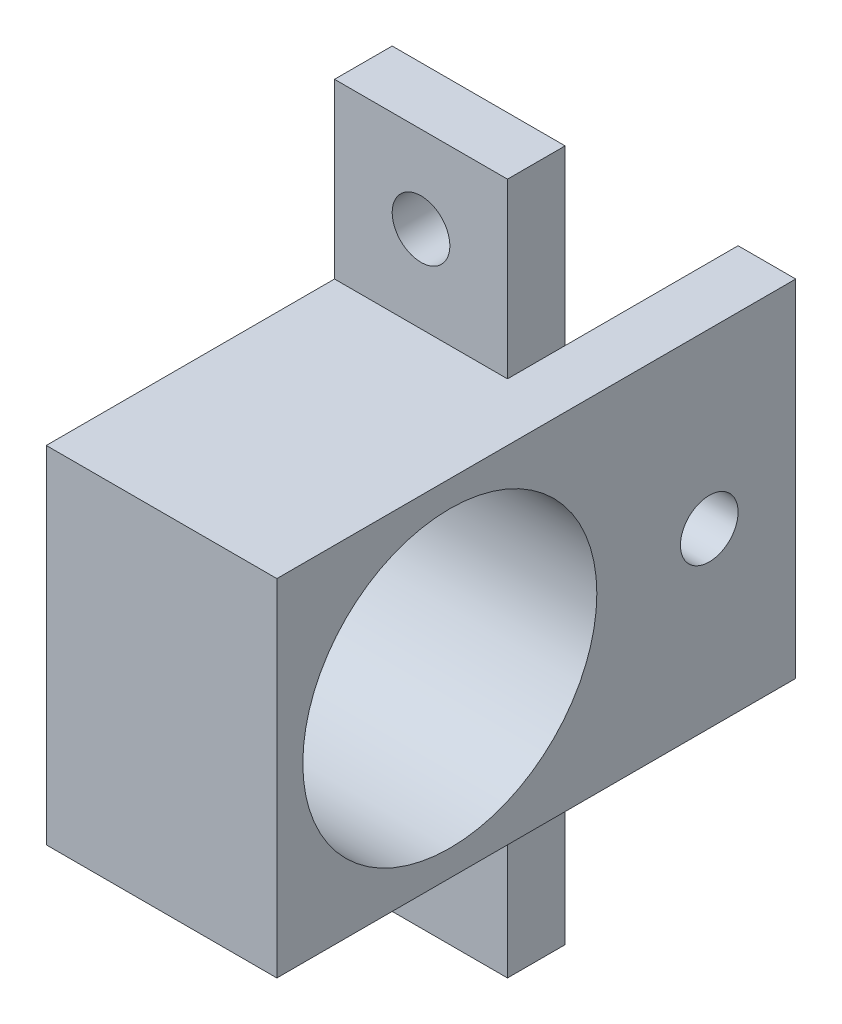
ISO-10303-21;
HEADER;
FILE_DESCRIPTION(('STEP AP214'),'2;1');
FILE_NAME('part.step','',(''),(''),'','','');
FILE_SCHEMA(('AUTOMOTIVE_DESIGN { 1 0 10303 214 1 1 1 1 }'));
ENDSEC;
DATA;
#1=APPLICATION_CONTEXT('core data for automotive mechanical design processes');
#2=APPLICATION_PROTOCOL_DEFINITION('international standard','automotive_design',2000,#1);
#3=PRODUCT_CONTEXT('',#1,'mechanical');
#4=PRODUCT('Part','Part','',(#3));
#5=PRODUCT_RELATED_PRODUCT_CATEGORY('part','',(#4));
#6=PRODUCT_DEFINITION_FORMATION('','',#4);
#7=PRODUCT_DEFINITION_CONTEXT('part definition',#1,'design');
#8=PRODUCT_DEFINITION('design','',#6,#7);
#9=PRODUCT_DEFINITION_SHAPE('','',#8);
#10=(LENGTH_UNIT() NAMED_UNIT(*) SI_UNIT(.MILLI.,.METRE.));
#11=(NAMED_UNIT(*) PLANE_ANGLE_UNIT() SI_UNIT($,.RADIAN.));
#12=(NAMED_UNIT(*) SI_UNIT($,.STERADIAN.) SOLID_ANGLE_UNIT());
#13=UNCERTAINTY_MEASURE_WITH_UNIT(LENGTH_MEASURE(1.E-05),#10,'distance_accuracy_value','');
#14=(GEOMETRIC_REPRESENTATION_CONTEXT(3) GLOBAL_UNCERTAINTY_ASSIGNED_CONTEXT((#13)) GLOBAL_UNIT_ASSIGNED_CONTEXT((#10,
#11,#12)) REPRESENTATION_CONTEXT('',''));
#15=CARTESIAN_POINT('',(0.,0.,0.));
#16=DIRECTION('',(0.,0.,1.));
#17=DIRECTION('',(1.,0.,0.));
#18=AXIS2_PLACEMENT_3D('',#15,#16,#17);
#19=CARTESIAN_POINT('',(0.,30.,30.));
#20=DIRECTION('',(0.,-1.,0.));
#21=DIRECTION('',(0.,0.,-1.));
#22=AXIS2_PLACEMENT_3D('',#19,#20,#21);
#23=PLANE('',#22);
#24=DIRECTION('',(0.,0.,-1.));
#25=VECTOR('',#24,1.);
#26=CARTESIAN_POINT('',(0.,30.,5.));
#27=LINE('',#26,#25);
#28=CARTESIAN_POINT('',(0.,30.,5.));
#29=VERTEX_POINT('',#28);
#30=CARTESIAN_POINT('',(0.,30.,0.));
#31=VERTEX_POINT('',#30);
#32=EDGE_CURVE('E137',#29,#31,#27,.T.);
#33=ORIENTED_EDGE('',*,*,#32,.F.);
#34=DIRECTION('',(1.,0.,0.));
#35=VECTOR('',#34,1.);
#36=CARTESIAN_POINT('',(0.,30.,5.));
#37=LINE('',#36,#35);
#38=CARTESIAN_POINT('',(-15.,30.,5.));
#39=VERTEX_POINT('',#38);
#40=EDGE_CURVE('E65',#39,#29,#37,.T.);
#41=ORIENTED_EDGE('',*,*,#40,.F.);
#42=DIRECTION('',(0.,0.,-1.));
#43=VECTOR('',#42,1.);
#44=CARTESIAN_POINT('',(-15.,30.,30.));
#45=LINE('',#44,#43);
#46=CARTESIAN_POINT('',(-15.,30.,30.));
#47=VERTEX_POINT('',#46);
#48=EDGE_CURVE('E11',#47,#39,#45,.T.);
#49=ORIENTED_EDGE('',*,*,#48,.F.);
#50=DIRECTION('',(-1.,0.,0.));
#51=VECTOR('',#50,1.);
#52=CARTESIAN_POINT('',(0.,30.,30.));
#53=LINE('',#52,#51);
#54=CARTESIAN_POINT('',(5.,30.,30.));
#55=VERTEX_POINT('',#54);
#56=EDGE_CURVE('E73',#55,#47,#53,.T.);
#57=ORIENTED_EDGE('',*,*,#56,.F.);
#58=DIRECTION('',(0.,0.,1.));
#59=VECTOR('',#58,1.);
#60=CARTESIAN_POINT('',(5.,30.,30.));
#61=LINE('',#60,#59);
#62=CARTESIAN_POINT('',(5.,30.,-15.));
#63=VERTEX_POINT('',#62);
#64=EDGE_CURVE('E255',#63,#55,#61,.T.);
#65=ORIENTED_EDGE('',*,*,#64,.F.);
#66=DIRECTION('',(-1.,0.,0.));
#67=VECTOR('',#66,1.);
#68=CARTESIAN_POINT('',(5.,30.,-15.));
#69=LINE('',#68,#67);
#70=CARTESIAN_POINT('',(0.,30.,-15.));
#71=VERTEX_POINT('',#70);
#72=EDGE_CURVE('E257',#63,#71,#69,.T.);
#73=ORIENTED_EDGE('',*,*,#72,.T.);
#74=DIRECTION('',(0.,0.,1.));
#75=VECTOR('',#74,1.);
#76=CARTESIAN_POINT('',(0.,30.,30.));
#77=LINE('',#76,#75);
#78=EDGE_CURVE('E142',#71,#31,#77,.T.);
#79=ORIENTED_EDGE('',*,*,#78,.T.);
#80=EDGE_LOOP('',(#33,#41,#49,#57,#65,#73,#79));
#81=FACE_BOUND('',#80,.T.);
#82=ADVANCED_FACE('F50',(#81),#23,.F.);
#83=CARTESIAN_POINT('',(0.,0.,30.));
#84=DIRECTION('',(0.,-1.,0.));
#85=DIRECTION('',(0.,0.,-1.));
#86=AXIS2_PLACEMENT_3D('',#83,#84,#85);
#87=PLANE('',#86);
#88=DIRECTION('',(-1.,0.,0.));
#89=VECTOR('',#88,1.);
#90=CARTESIAN_POINT('',(0.,0.,5.));
#91=LINE('',#90,#89);
#92=CARTESIAN_POINT('',(0.,0.,5.));
#93=VERTEX_POINT('',#92);
#94=CARTESIAN_POINT('',(-15.,0.,5.));
#95=VERTEX_POINT('',#94);
#96=EDGE_CURVE('E199',#93,#95,#91,.T.);
#97=ORIENTED_EDGE('',*,*,#96,.F.);
#98=DIRECTION('',(0.,0.,-1.));
#99=VECTOR('',#98,1.);
#100=CARTESIAN_POINT('',(0.,0.,5.));
#101=LINE('',#100,#99);
#102=CARTESIAN_POINT('',(0.,0.,0.));
#103=VERTEX_POINT('',#102);
#104=EDGE_CURVE('E214',#93,#103,#101,.T.);
#105=ORIENTED_EDGE('',*,*,#104,.T.);
#106=DIRECTION('',(0.,0.,-1.));
#107=VECTOR('',#106,1.);
#108=CARTESIAN_POINT('',(0.,0.,30.));
#109=LINE('',#108,#107);
#110=CARTESIAN_POINT('',(0.,0.,-15.));
#111=VERTEX_POINT('',#110);
#112=EDGE_CURVE('E242',#103,#111,#109,.T.);
#113=ORIENTED_EDGE('',*,*,#112,.T.);
#114=DIRECTION('',(-1.,0.,0.));
#115=VECTOR('',#114,1.);
#116=CARTESIAN_POINT('',(5.,0.,-15.));
#117=LINE('',#116,#115);
#118=CARTESIAN_POINT('',(5.,0.,-15.));
#119=VERTEX_POINT('',#118);
#120=EDGE_CURVE('E269',#119,#111,#117,.T.);
#121=ORIENTED_EDGE('',*,*,#120,.F.);
#122=DIRECTION('',(0.,0.,-1.));
#123=VECTOR('',#122,1.);
#124=CARTESIAN_POINT('',(5.,0.,30.));
#125=LINE('',#124,#123);
#126=CARTESIAN_POINT('',(5.,0.,30.));
#127=VERTEX_POINT('',#126);
#128=EDGE_CURVE('E244',#127,#119,#125,.T.);
#129=ORIENTED_EDGE('',*,*,#128,.F.);
#130=DIRECTION('',(-1.,0.,0.));
#131=VECTOR('',#130,1.);
#132=CARTESIAN_POINT('',(0.,0.,30.));
#133=LINE('',#132,#131);
#134=CARTESIAN_POINT('',(-15.,0.,30.));
#135=VERTEX_POINT('',#134);
#136=EDGE_CURVE('E273',#127,#135,#133,.T.);
#137=ORIENTED_EDGE('',*,*,#136,.T.);
#138=DIRECTION('',(0.,0.,-1.));
#139=VECTOR('',#138,1.);
#140=CARTESIAN_POINT('',(-15.,0.,30.));
#141=LINE('',#140,#139);
#142=EDGE_CURVE('E51',#135,#95,#141,.T.);
#143=ORIENTED_EDGE('',*,*,#142,.T.);
#144=EDGE_LOOP('',(#97,#105,#113,#121,#129,#137,#143));
#145=FACE_BOUND('',#144,.T.);
#146=ADVANCED_FACE('F47',(#145),#87,.T.);
#147=CARTESIAN_POINT('',(-15.,0.,30.));
#148=DIRECTION('',(-1.,0.,0.));
#149=DIRECTION('',(0.,0.,1.));
#150=AXIS2_PLACEMENT_3D('',#147,#148,#149);
#151=PLANE('',#150);
#152=CARTESIAN_POINT('',(-15.,15.,15.));
#153=DIRECTION('',(1.,0.,0.));
#154=DIRECTION('',(0.,0.,-1.));
#155=AXIS2_PLACEMENT_3D('',#152,#153,#154);
#156=CIRCLE('',#155,12.75);
#157=CARTESIAN_POINT('',(-15.,15.,2.25));
#158=VERTEX_POINT('',#157);
#159=EDGE_CURVE('E230',#158,#158,#156,.T.);
#160=ORIENTED_EDGE('',*,*,#159,.T.);
#161=EDGE_LOOP('',(#160));
#162=FACE_BOUND('',#161,.T.);
#163=DIRECTION('',(0.,1.,0.));
#164=VECTOR('',#163,1.);
#165=CARTESIAN_POINT('',(-15.,0.,0.));
#166=LINE('',#165,#164);
#167=CARTESIAN_POINT('',(-15.,-15.,0.));
#168=VERTEX_POINT('',#167);
#169=CARTESIAN_POINT('',(-15.,45.,0.));
#170=VERTEX_POINT('',#169);
#171=EDGE_CURVE('E274',#168,#170,#166,.T.);
#172=ORIENTED_EDGE('',*,*,#171,.F.);
#173=DIRECTION('',(0.,0.,-1.));
#174=VECTOR('',#173,1.);
#175=CARTESIAN_POINT('',(-15.,-15.,5.));
#176=LINE('',#175,#174);
#177=CARTESIAN_POINT('',(-15.,-15.,5.));
#178=VERTEX_POINT('',#177);
#179=EDGE_CURVE('E179',#178,#168,#176,.T.);
#180=ORIENTED_EDGE('',*,*,#179,.F.);
#181=DIRECTION('',(0.,-1.,0.));
#182=VECTOR('',#181,1.);
#183=CARTESIAN_POINT('',(-15.,0.,5.));
#184=LINE('',#183,#182);
#185=EDGE_CURVE('E206',#95,#178,#184,.T.);
#186=ORIENTED_EDGE('',*,*,#185,.F.);
#187=ORIENTED_EDGE('',*,*,#142,.F.);
#188=DIRECTION('',(0.,1.,0.));
#189=VECTOR('',#188,1.);
#190=CARTESIAN_POINT('',(-15.,0.,30.));
#191=LINE('',#190,#189);
#192=EDGE_CURVE('E278',#135,#47,#191,.T.);
#193=ORIENTED_EDGE('',*,*,#192,.T.);
#194=ORIENTED_EDGE('',*,*,#48,.T.);
#195=DIRECTION('',(0.,1.,0.));
#196=VECTOR('',#195,1.);
#197=CARTESIAN_POINT('',(-15.,0.,5.));
#198=LINE('',#197,#196);
#199=CARTESIAN_POINT('',(-15.,45.,5.));
#200=VERTEX_POINT('',#199);
#201=EDGE_CURVE('E160',#39,#200,#198,.T.);
#202=ORIENTED_EDGE('',*,*,#201,.T.);
#203=DIRECTION('',(0.,0.,-1.));
#204=VECTOR('',#203,1.);
#205=CARTESIAN_POINT('',(-15.,45.,5.));
#206=LINE('',#205,#204);
#207=EDGE_CURVE('E146',#200,#170,#206,.T.);
#208=ORIENTED_EDGE('',*,*,#207,.T.);
#209=EDGE_LOOP('',(#172,#180,#186,#187,#193,#194,#202,#208));
#210=FACE_BOUND('',#209,.T.);
#211=ADVANCED_FACE('F295',(#162,#210),#151,.T.);
#212=CARTESIAN_POINT('',(0.,0.,30.));
#213=DIRECTION('',(0.,0.,-1.));
#214=DIRECTION('',(-1.,0.,0.));
#215=AXIS2_PLACEMENT_3D('',#212,#213,#214);
#216=PLANE('',#215);
#217=ORIENTED_EDGE('',*,*,#136,.F.);
#218=DIRECTION('',(0.,-1.,0.));
#219=VECTOR('',#218,1.);
#220=CARTESIAN_POINT('',(5.,0.,30.));
#221=LINE('',#220,#219);
#222=EDGE_CURVE('E259',#55,#127,#221,.T.);
#223=ORIENTED_EDGE('',*,*,#222,.F.);
#224=ORIENTED_EDGE('',*,*,#56,.T.);
#225=ORIENTED_EDGE('',*,*,#192,.F.);
#226=EDGE_LOOP('',(#217,#223,#224,#225));
#227=FACE_BOUND('',#226,.T.);
#228=ADVANCED_FACE('F298',(#227),#216,.F.);
#229=CARTESIAN_POINT('',(0.,0.,0.));
#230=DIRECTION('',(0.,0.,-1.));
#231=DIRECTION('',(-1.,0.,0.));
#232=AXIS2_PLACEMENT_3D('',#229,#230,#231);
#233=PLANE('',#232);
#234=DIRECTION('',(0.,1.,0.));
#235=VECTOR('',#234,1.);
#236=CARTESIAN_POINT('',(0.,0.,0.));
#237=LINE('',#236,#235);
#238=EDGE_CURVE('E87',#103,#31,#237,.T.);
#239=ORIENTED_EDGE('',*,*,#238,.F.);
#240=DIRECTION('',(0.,-1.,0.));
#241=VECTOR('',#240,1.);
#242=CARTESIAN_POINT('',(0.,0.,0.));
#243=LINE('',#242,#241);
#244=CARTESIAN_POINT('',(0.,-15.,0.));
#245=VERTEX_POINT('',#244);
#246=EDGE_CURVE('E81',#103,#245,#243,.T.);
#247=ORIENTED_EDGE('',*,*,#246,.T.);
#248=DIRECTION('',(1.,0.,0.));
#249=VECTOR('',#248,1.);
#250=CARTESIAN_POINT('',(0.,-15.,0.));
#251=LINE('',#250,#249);
#252=EDGE_CURVE('E196',#168,#245,#251,.T.);
#253=ORIENTED_EDGE('',*,*,#252,.F.);
#254=ORIENTED_EDGE('',*,*,#171,.T.);
#255=DIRECTION('',(1.,0.,0.));
#256=VECTOR('',#255,1.);
#257=CARTESIAN_POINT('',(0.,45.,0.));
#258=LINE('',#257,#256);
#259=CARTESIAN_POINT('',(0.,45.,0.));
#260=VERTEX_POINT('',#259);
#261=EDGE_CURVE('E166',#170,#260,#258,.T.);
#262=ORIENTED_EDGE('',*,*,#261,.T.);
#263=DIRECTION('',(0.,1.,0.));
#264=VECTOR('',#263,1.);
#265=CARTESIAN_POINT('',(0.,0.,0.));
#266=LINE('',#265,#264);
#267=EDGE_CURVE('E177',#31,#260,#266,.T.);
#268=ORIENTED_EDGE('',*,*,#267,.F.);
#269=EDGE_LOOP('',(#239,#247,#253,#254,#262,#268));
#270=FACE_BOUND('',#269,.T.);
#271=CARTESIAN_POINT('',(-7.5,37.5,0.));
#272=DIRECTION('',(0.,0.,-1.));
#273=DIRECTION('',(-1.,0.,0.));
#274=AXIS2_PLACEMENT_3D('',#271,#272,#273);
#275=CIRCLE('',#274,2.5);
#276=CARTESIAN_POINT('',(-10.,37.5,0.));
#277=VERTEX_POINT('',#276);
#278=EDGE_CURVE('E174',#277,#277,#275,.T.);
#279=ORIENTED_EDGE('',*,*,#278,.F.);
#280=EDGE_LOOP('',(#279));
#281=FACE_BOUND('',#280,.T.);
#282=CARTESIAN_POINT('',(-7.5,-7.5,0.));
#283=DIRECTION('',(0.,0.,-1.));
#284=DIRECTION('',(-1.,0.,0.));
#285=AXIS2_PLACEMENT_3D('',#282,#283,#284);
#286=CIRCLE('',#285,2.5);
#287=CARTESIAN_POINT('',(-10.,-7.5,0.));
#288=VERTEX_POINT('',#287);
#289=EDGE_CURVE('E211',#288,#288,#286,.T.);
#290=ORIENTED_EDGE('',*,*,#289,.F.);
#291=EDGE_LOOP('',(#290));
#292=FACE_BOUND('',#291,.T.);
#293=ADVANCED_FACE('F307',(#270,#281,#292),#233,.T.);
#294=CARTESIAN_POINT('',(0.,0.,0.));
#295=DIRECTION('',(1.,0.,0.));
#296=DIRECTION('',(0.,0.,-1.));
#297=AXIS2_PLACEMENT_3D('',#294,#295,#296);
#298=PLANE('',#297);
#299=CARTESIAN_POINT('',(0.,15.,-7.5));
#300=DIRECTION('',(1.,0.,0.));
#301=DIRECTION('',(0.,0.,-1.));
#302=AXIS2_PLACEMENT_3D('',#299,#300,#301);
#303=CIRCLE('',#302,2.5);
#304=CARTESIAN_POINT('',(0.,15.,-10.));
#305=VERTEX_POINT('',#304);
#306=EDGE_CURVE('E239',#305,#305,#303,.T.);
#307=ORIENTED_EDGE('',*,*,#306,.T.);
#308=EDGE_LOOP('',(#307));
#309=FACE_BOUND('',#308,.T.);
#310=ORIENTED_EDGE('',*,*,#112,.F.);
#311=ORIENTED_EDGE('',*,*,#238,.T.);
#312=ORIENTED_EDGE('',*,*,#78,.F.);
#313=DIRECTION('',(0.,1.,0.));
#314=VECTOR('',#313,1.);
#315=CARTESIAN_POINT('',(0.,0.,-15.));
#316=LINE('',#315,#314);
#317=EDGE_CURVE('E265',#111,#71,#316,.T.);
#318=ORIENTED_EDGE('',*,*,#317,.F.);
#319=EDGE_LOOP('',(#310,#311,#312,#318));
#320=FACE_BOUND('',#319,.T.);
#321=ADVANCED_FACE('F318',(#309,#320),#298,.F.);
#322=CARTESIAN_POINT('',(5.,0.,-15.));
#323=DIRECTION('',(0.,0.,1.));
#324=DIRECTION('',(1.,0.,0.));
#325=AXIS2_PLACEMENT_3D('',#322,#323,#324);
#326=PLANE('',#325);
#327=ORIENTED_EDGE('',*,*,#317,.T.);
#328=ORIENTED_EDGE('',*,*,#72,.F.);
#329=DIRECTION('',(0.,1.,0.));
#330=VECTOR('',#329,1.);
#331=CARTESIAN_POINT('',(5.,0.,-15.));
#332=LINE('',#331,#330);
#333=EDGE_CURVE('E248',#119,#63,#332,.T.);
#334=ORIENTED_EDGE('',*,*,#333,.F.);
#335=ORIENTED_EDGE('',*,*,#120,.T.);
#336=EDGE_LOOP('',(#327,#328,#334,#335));
#337=FACE_BOUND('',#336,.T.);
#338=ADVANCED_FACE('F303',(#337),#326,.F.);
#339=CARTESIAN_POINT('',(5.,0.,0.));
#340=DIRECTION('',(1.,0.,0.));
#341=DIRECTION('',(0.,0.,-1.));
#342=AXIS2_PLACEMENT_3D('',#339,#340,#341);
#343=PLANE('',#342);
#344=CARTESIAN_POINT('',(5.,15.,15.));
#345=DIRECTION('',(1.,0.,0.));
#346=DIRECTION('',(0.,0.,-1.));
#347=AXIS2_PLACEMENT_3D('',#344,#345,#346);
#348=CIRCLE('',#347,12.75);
#349=CARTESIAN_POINT('',(5.,15.,2.25));
#350=VERTEX_POINT('',#349);
#351=EDGE_CURVE('E189',#350,#350,#348,.T.);
#352=ORIENTED_EDGE('',*,*,#351,.F.);
#353=EDGE_LOOP('',(#352));
#354=FACE_BOUND('',#353,.T.);
#355=CARTESIAN_POINT('',(5.,15.,-7.5));
#356=DIRECTION('',(1.,0.,0.));
#357=DIRECTION('',(0.,0.,-1.));
#358=AXIS2_PLACEMENT_3D('',#355,#356,#357);
#359=CIRCLE('',#358,2.5);
#360=CARTESIAN_POINT('',(5.,15.,-10.));
#361=VERTEX_POINT('',#360);
#362=EDGE_CURVE('E231',#361,#361,#359,.T.);
#363=ORIENTED_EDGE('',*,*,#362,.F.);
#364=EDGE_LOOP('',(#363));
#365=FACE_BOUND('',#364,.T.);
#366=ORIENTED_EDGE('',*,*,#128,.T.);
#367=ORIENTED_EDGE('',*,*,#333,.T.);
#368=ORIENTED_EDGE('',*,*,#64,.T.);
#369=ORIENTED_EDGE('',*,*,#222,.T.);
#370=EDGE_LOOP('',(#366,#367,#368,#369));
#371=FACE_BOUND('',#370,.T.);
#372=ADVANCED_FACE('F296',(#354,#365,#371),#343,.T.);
#373=CARTESIAN_POINT('',(-15.,15.,-7.5));
#374=DIRECTION('',(1.,0.,0.));
#375=DIRECTION('',(0.,0.,-1.));
#376=AXIS2_PLACEMENT_3D('',#373,#374,#375);
#377=CYLINDRICAL_SURFACE('',#376,2.5);
#378=ORIENTED_EDGE('',*,*,#362,.T.);
#379=EDGE_LOOP('',(#378));
#380=FACE_BOUND('',#379,.T.);
#381=ORIENTED_EDGE('',*,*,#306,.F.);
#382=EDGE_LOOP('',(#381));
#383=FACE_BOUND('',#382,.T.);
#384=ADVANCED_FACE('F350',(#380,#383),#377,.F.);
#385=CARTESIAN_POINT('',(-15.,15.,15.));
#386=DIRECTION('',(1.,0.,0.));
#387=DIRECTION('',(0.,0.,-1.));
#388=AXIS2_PLACEMENT_3D('',#385,#386,#387);
#389=CYLINDRICAL_SURFACE('',#388,12.75);
#390=ORIENTED_EDGE('',*,*,#159,.F.);
#391=EDGE_LOOP('',(#390));
#392=FACE_BOUND('',#391,.T.);
#393=ORIENTED_EDGE('',*,*,#351,.T.);
#394=EDGE_LOOP('',(#393));
#395=FACE_BOUND('',#394,.T.);
#396=ADVANCED_FACE('F349',(#392,#395),#389,.F.);
#397=CARTESIAN_POINT('',(0.,0.,5.));
#398=DIRECTION('',(-1.,0.,0.));
#399=DIRECTION('',(0.,-1.,0.));
#400=AXIS2_PLACEMENT_3D('',#397,#398,#399);
#401=PLANE('',#400);
#402=ORIENTED_EDGE('',*,*,#267,.T.);
#403=DIRECTION('',(0.,0.,-1.));
#404=VECTOR('',#403,1.);
#405=CARTESIAN_POINT('',(0.,45.,5.));
#406=LINE('',#405,#404);
#407=CARTESIAN_POINT('',(0.,45.,5.));
#408=VERTEX_POINT('',#407);
#409=EDGE_CURVE('E163',#408,#260,#406,.T.);
#410=ORIENTED_EDGE('',*,*,#409,.F.);
#411=DIRECTION('',(0.,1.,0.));
#412=VECTOR('',#411,1.);
#413=CARTESIAN_POINT('',(0.,0.,5.));
#414=LINE('',#413,#412);
#415=EDGE_CURVE('E153',#29,#408,#414,.T.);
#416=ORIENTED_EDGE('',*,*,#415,.F.);
#417=ORIENTED_EDGE('',*,*,#32,.T.);
#418=EDGE_LOOP('',(#402,#410,#416,#417));
#419=FACE_BOUND('',#418,.T.);
#420=ADVANCED_FACE('F159',(#419),#401,.F.);
#421=CARTESIAN_POINT('',(0.,45.,5.));
#422=DIRECTION('',(0.,1.,0.));
#423=DIRECTION('',(0.,0.,1.));
#424=AXIS2_PLACEMENT_3D('',#421,#422,#423);
#425=PLANE('',#424);
#426=ORIENTED_EDGE('',*,*,#261,.F.);
#427=ORIENTED_EDGE('',*,*,#207,.F.);
#428=DIRECTION('',(1.,0.,0.));
#429=VECTOR('',#428,1.);
#430=CARTESIAN_POINT('',(0.,45.,5.));
#431=LINE('',#430,#429);
#432=EDGE_CURVE('E150',#200,#408,#431,.T.);
#433=ORIENTED_EDGE('',*,*,#432,.T.);
#434=ORIENTED_EDGE('',*,*,#409,.T.);
#435=EDGE_LOOP('',(#426,#427,#433,#434));
#436=FACE_BOUND('',#435,.T.);
#437=ADVANCED_FACE('F310',(#436),#425,.T.);
#438=CARTESIAN_POINT('',(-7.5,37.5,5.));
#439=DIRECTION('',(0.,0.,-1.));
#440=DIRECTION('',(-1.,0.,0.));
#441=AXIS2_PLACEMENT_3D('',#438,#439,#440);
#442=CYLINDRICAL_SURFACE('',#441,2.5);
#443=CARTESIAN_POINT('',(-7.5,37.5,5.));
#444=DIRECTION('',(0.,0.,-1.));
#445=DIRECTION('',(-1.,0.,0.));
#446=AXIS2_PLACEMENT_3D('',#443,#444,#445);
#447=CIRCLE('',#446,2.5);
#448=CARTESIAN_POINT('',(-10.,37.5,5.));
#449=VERTEX_POINT('',#448);
#450=EDGE_CURVE('E165',#449,#449,#447,.T.);
#451=ORIENTED_EDGE('',*,*,#450,.F.);
#452=EDGE_LOOP('',(#451));
#453=FACE_BOUND('',#452,.T.);
#454=ORIENTED_EDGE('',*,*,#278,.T.);
#455=EDGE_LOOP('',(#454));
#456=FACE_BOUND('',#455,.T.);
#457=ADVANCED_FACE('F372',(#453,#456),#442,.F.);
#458=CARTESIAN_POINT('',(0.,0.,5.));
#459=DIRECTION('',(0.,0.,-1.));
#460=DIRECTION('',(-1.,0.,0.));
#461=AXIS2_PLACEMENT_3D('',#458,#459,#460);
#462=PLANE('',#461);
#463=ORIENTED_EDGE('',*,*,#450,.T.);
#464=EDGE_LOOP('',(#463));
#465=FACE_BOUND('',#464,.T.);
#466=ORIENTED_EDGE('',*,*,#415,.T.);
#467=ORIENTED_EDGE('',*,*,#432,.F.);
#468=ORIENTED_EDGE('',*,*,#201,.F.);
#469=ORIENTED_EDGE('',*,*,#40,.T.);
#470=EDGE_LOOP('',(#466,#467,#468,#469));
#471=FACE_BOUND('',#470,.T.);
#472=ADVANCED_FACE('F151',(#465,#471),#462,.F.);
#473=CARTESIAN_POINT('',(0.,-15.,5.));
#474=DIRECTION('',(0.,1.,0.));
#475=DIRECTION('',(0.,0.,1.));
#476=AXIS2_PLACEMENT_3D('',#473,#474,#475);
#477=PLANE('',#476);
#478=ORIENTED_EDGE('',*,*,#252,.T.);
#479=DIRECTION('',(0.,0.,-1.));
#480=VECTOR('',#479,1.);
#481=CARTESIAN_POINT('',(0.,-15.,5.));
#482=LINE('',#481,#480);
#483=CARTESIAN_POINT('',(0.,-15.,5.));
#484=VERTEX_POINT('',#483);
#485=EDGE_CURVE('E222',#484,#245,#482,.T.);
#486=ORIENTED_EDGE('',*,*,#485,.F.);
#487=DIRECTION('',(1.,0.,0.));
#488=VECTOR('',#487,1.);
#489=CARTESIAN_POINT('',(0.,-15.,5.));
#490=LINE('',#489,#488);
#491=EDGE_CURVE('E204',#178,#484,#490,.T.);
#492=ORIENTED_EDGE('',*,*,#491,.F.);
#493=ORIENTED_EDGE('',*,*,#179,.T.);
#494=EDGE_LOOP('',(#478,#486,#492,#493));
#495=FACE_BOUND('',#494,.T.);
#496=ADVANCED_FACE('F313',(#495),#477,.F.);
#497=CARTESIAN_POINT('',(-7.5,-7.5,5.));
#498=DIRECTION('',(0.,0.,-1.));
#499=DIRECTION('',(-1.,0.,0.));
#500=AXIS2_PLACEMENT_3D('',#497,#498,#499);
#501=CYLINDRICAL_SURFACE('',#500,2.5);
#502=CARTESIAN_POINT('',(-7.5,-7.5,5.));
#503=DIRECTION('',(0.,0.,-1.));
#504=DIRECTION('',(-1.,0.,0.));
#505=AXIS2_PLACEMENT_3D('',#502,#503,#504);
#506=CIRCLE('',#505,2.5);
#507=CARTESIAN_POINT('',(-10.,-7.5,5.));
#508=VERTEX_POINT('',#507);
#509=EDGE_CURVE('E191',#508,#508,#506,.T.);
#510=ORIENTED_EDGE('',*,*,#509,.F.);
#511=EDGE_LOOP('',(#510));
#512=FACE_BOUND('',#511,.T.);
#513=ORIENTED_EDGE('',*,*,#289,.T.);
#514=EDGE_LOOP('',(#513));
#515=FACE_BOUND('',#514,.T.);
#516=ADVANCED_FACE('F361',(#512,#515),#501,.F.);
#517=CARTESIAN_POINT('',(0.,0.,5.));
#518=DIRECTION('',(1.,0.,0.));
#519=DIRECTION('',(0.,0.,-1.));
#520=AXIS2_PLACEMENT_3D('',#517,#518,#519);
#521=PLANE('',#520);
#522=ORIENTED_EDGE('',*,*,#246,.F.);
#523=ORIENTED_EDGE('',*,*,#104,.F.);
#524=DIRECTION('',(0.,-1.,0.));
#525=VECTOR('',#524,1.);
#526=CARTESIAN_POINT('',(0.,0.,5.));
#527=LINE('',#526,#525);
#528=EDGE_CURVE('E203',#93,#484,#527,.T.);
#529=ORIENTED_EDGE('',*,*,#528,.T.);
#530=ORIENTED_EDGE('',*,*,#485,.T.);
#531=EDGE_LOOP('',(#522,#523,#529,#530));
#532=FACE_BOUND('',#531,.T.);
#533=ADVANCED_FACE('F316',(#532),#521,.T.);
#534=CARTESIAN_POINT('',(0.,0.,5.));
#535=DIRECTION('',(0.,0.,-1.));
#536=DIRECTION('',(-1.,0.,0.));
#537=AXIS2_PLACEMENT_3D('',#534,#535,#536);
#538=PLANE('',#537);
#539=ORIENTED_EDGE('',*,*,#509,.T.);
#540=EDGE_LOOP('',(#539));
#541=FACE_BOUND('',#540,.T.);
#542=ORIENTED_EDGE('',*,*,#96,.T.);
#543=ORIENTED_EDGE('',*,*,#185,.T.);
#544=ORIENTED_EDGE('',*,*,#491,.T.);
#545=ORIENTED_EDGE('',*,*,#528,.F.);
#546=EDGE_LOOP('',(#542,#543,#544,#545));
#547=FACE_BOUND('',#546,.T.);
#548=ADVANCED_FACE('F319',(#541,#547),#538,.F.);
#549=CLOSED_SHELL('',(#82,#146,#211,#228,#293,#321,#338,#372,#384,#396,#420,#437,#457,#472,#496,
#516,#533,#548));
#550=MANIFOLD_SOLID_BREP('B2',#549);
#551=ADVANCED_BREP_SHAPE_REPRESENTATION('',(#18,#550),#14);
#552=SHAPE_DEFINITION_REPRESENTATION(#9,#551);
ENDSEC;
END-ISO-10303-21;
